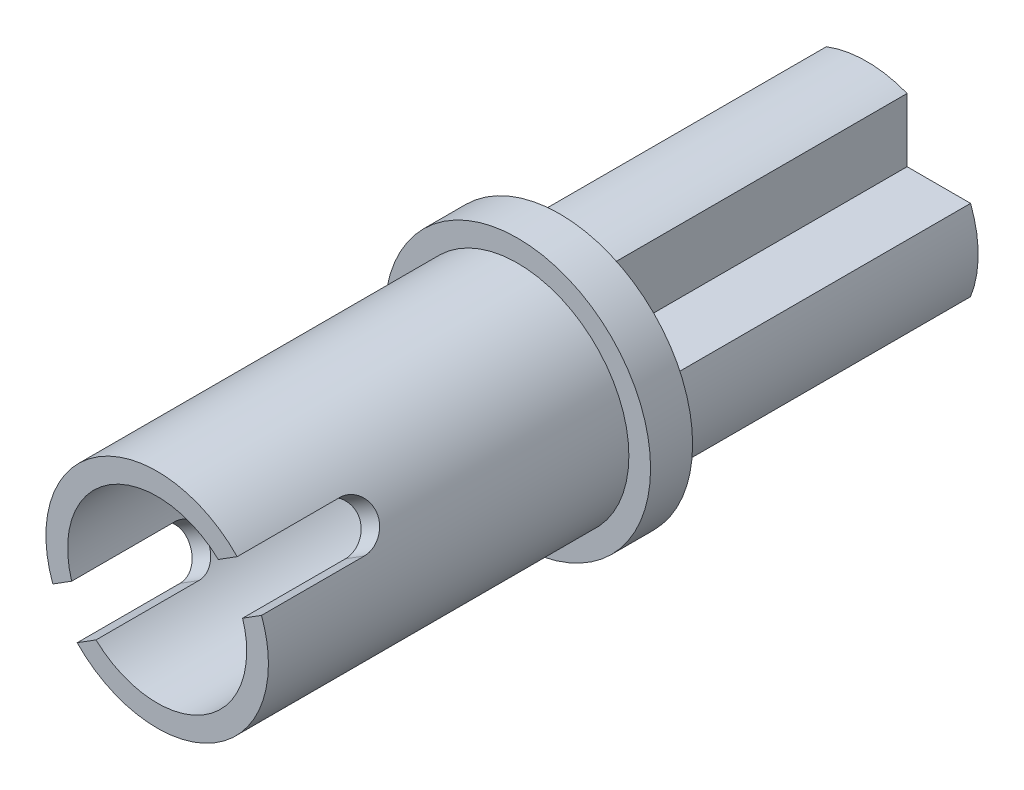
ISO-10303-21;
HEADER;
FILE_DESCRIPTION(('STEP AP214'),'2;1');
FILE_NAME('part.step','',(''),(''),'','','');
FILE_SCHEMA(('AUTOMOTIVE_DESIGN { 1 0 10303 214 1 1 1 1 }'));
ENDSEC;
DATA;
#1=APPLICATION_CONTEXT('core data for automotive mechanical design processes');
#2=APPLICATION_PROTOCOL_DEFINITION('international standard','automotive_design',2000,#1);
#3=PRODUCT_CONTEXT('',#1,'mechanical');
#4=PRODUCT('Part','Part','',(#3));
#5=PRODUCT_RELATED_PRODUCT_CATEGORY('part','',(#4));
#6=PRODUCT_DEFINITION_FORMATION('','',#4);
#7=PRODUCT_DEFINITION_CONTEXT('part definition',#1,'design');
#8=PRODUCT_DEFINITION('design','',#6,#7);
#9=PRODUCT_DEFINITION_SHAPE('','',#8);
#10=(LENGTH_UNIT() NAMED_UNIT(*) SI_UNIT(.MILLI.,.METRE.));
#11=(NAMED_UNIT(*) PLANE_ANGLE_UNIT() SI_UNIT($,.RADIAN.));
#12=(NAMED_UNIT(*) SI_UNIT($,.STERADIAN.) SOLID_ANGLE_UNIT());
#13=UNCERTAINTY_MEASURE_WITH_UNIT(LENGTH_MEASURE(1.E-05),#10,'distance_accuracy_value','');
#14=(GEOMETRIC_REPRESENTATION_CONTEXT(3) GLOBAL_UNCERTAINTY_ASSIGNED_CONTEXT((#13)) GLOBAL_UNIT_ASSIGNED_CONTEXT((#10,
#11,#12)) REPRESENTATION_CONTEXT('',''));
#15=CARTESIAN_POINT('',(0.,0.,0.));
#16=DIRECTION('',(0.,0.,1.));
#17=DIRECTION('',(1.,0.,0.));
#18=AXIS2_PLACEMENT_3D('',#15,#16,#17);
#19=CARTESIAN_POINT('',(0.,0.,15.53));
#20=DIRECTION('',(0.,0.,-1.));
#21=DIRECTION('',(-1.,0.,0.));
#22=AXIS2_PLACEMENT_3D('',#19,#20,#21);
#23=CYLINDRICAL_SURFACE('',#22,2.91);
#24=CARTESIAN_POINT('',(0.,0.,7.64));
#25=DIRECTION('',(0.,0.,1.));
#26=DIRECTION('',(1.,0.,0.));
#27=AXIS2_PLACEMENT_3D('',#24,#25,#26);
#28=CIRCLE('',#27,2.91);
#29=CARTESIAN_POINT('',(2.91,0.,7.64));
#30=VERTEX_POINT('',#29);
#31=EDGE_CURVE('E362',#30,#30,#28,.T.);
#32=ORIENTED_EDGE('',*,*,#31,.F.);
#33=EDGE_LOOP('',(#32));
#34=FACE_BOUND('',#33,.T.);
#35=CARTESIAN_POINT('',(0.,0.,6.72));
#36=DIRECTION('',(0.,0.,-1.));
#37=DIRECTION('',(-1.,0.,0.));
#38=AXIS2_PLACEMENT_3D('',#35,#36,#37);
#39=CIRCLE('',#38,2.91);
#40=CARTESIAN_POINT('',(-2.91,0.,6.72));
#41=VERTEX_POINT('',#40);
#42=EDGE_CURVE('E184',#41,#41,#39,.T.);
#43=ORIENTED_EDGE('',*,*,#42,.F.);
#44=EDGE_LOOP('',(#43));
#45=FACE_BOUND('',#44,.T.);
#46=ADVANCED_FACE('F33',(#34,#45),#23,.T.);
#47=CARTESIAN_POINT('',(0.,0.,15.53));
#48=DIRECTION('',(0.,0.,1.));
#49=DIRECTION('',(1.,0.,0.));
#50=AXIS2_PLACEMENT_3D('',#47,#48,#49);
#51=PLANE('',#50);
#52=DIRECTION('',(-0.846684812986622,-0.532094754210008,0.));
#53=VECTOR('',#52,1.);
#54=CARTESIAN_POINT('',(4.88471303194703,2.47923447772228,15.53));
#55=LINE('',#54,#53);
#56=CARTESIAN_POINT('',(-1.33854879318288,-1.43174268926671,15.53));
#57=VERTEX_POINT('',#56);
#58=CARTESIAN_POINT('',(-1.75169775094782,-1.69138404548593,15.53));
#59=VERTEX_POINT('',#58);
#60=EDGE_CURVE('E272',#57,#59,#55,.T.);
#61=ORIENTED_EDGE('',*,*,#60,.T.);
#62=CARTESIAN_POINT('',(0.,0.,15.53));
#63=DIRECTION('',(0.,0.,1.));
#64=DIRECTION('',(1.,0.,0.));
#65=AXIS2_PLACEMENT_3D('',#62,#63,#64);
#66=CIRCLE('',#65,2.435);
#67=CARTESIAN_POINT('',(2.28379250515783,0.8446992324993,15.53));
#68=VERTEX_POINT('',#67);
#69=EDGE_CURVE('E601',#59,#68,#66,.T.);
#70=ORIENTED_EDGE('',*,*,#69,.T.);
#71=CARTESIAN_POINT('',(1.87064354739289,0.585057876280083,15.53));
#72=VERTEX_POINT('',#71);
#73=EDGE_CURVE('E275',#68,#72,#55,.T.);
#74=ORIENTED_EDGE('',*,*,#73,.T.);
#75=CARTESIAN_POINT('',(0.,0.,15.53));
#76=DIRECTION('',(0.,0.,1.));
#77=DIRECTION('',(1.,0.,0.));
#78=AXIS2_PLACEMENT_3D('',#75,#76,#77);
#79=CIRCLE('',#78,1.96);
#80=EDGE_CURVE('E605',#57,#72,#79,.T.);
#81=ORIENTED_EDGE('',*,*,#80,.F.);
#82=EDGE_LOOP('',(#61,#70,#74,#81));
#83=FACE_BOUND('',#82,.T.);
#84=ADVANCED_FACE('F351',(#83),#51,.T.);
#85=CARTESIAN_POINT('',(0.,0.,7.64));
#86=DIRECTION('',(0.,0.,1.));
#87=DIRECTION('',(1.,0.,0.));
#88=AXIS2_PLACEMENT_3D('',#85,#86,#87);
#89=PLANE('',#88);
#90=CARTESIAN_POINT('',(0.,0.,7.64));
#91=DIRECTION('',(0.,0.,1.));
#92=DIRECTION('',(1.,0.,0.));
#93=AXIS2_PLACEMENT_3D('',#90,#91,#92);
#94=CIRCLE('',#93,2.435);
#95=CARTESIAN_POINT('',(2.435,0.,7.64));
#96=VERTEX_POINT('',#95);
#97=EDGE_CURVE('E594',#96,#96,#94,.T.);
#98=ORIENTED_EDGE('',*,*,#97,.F.);
#99=EDGE_LOOP('',(#98));
#100=FACE_BOUND('',#99,.T.);
#101=ORIENTED_EDGE('',*,*,#31,.T.);
#102=EDGE_LOOP('',(#101));
#103=FACE_BOUND('',#102,.T.);
#104=ADVANCED_FACE('F356',(#100,#103),#89,.T.);
#105=CARTESIAN_POINT('',(0.,0.,7.64));
#106=DIRECTION('',(0.,0.,1.));
#107=DIRECTION('',(1.,0.,0.));
#108=AXIS2_PLACEMENT_3D('',#105,#106,#107);
#109=CYLINDRICAL_SURFACE('',#108,2.435);
#110=CARTESIAN_POINT('',(-2.28379250515783,-0.844699232499302,13.28));
#111=CARTESIAN_POINT('',(-2.28378971702096,-0.844667637052202,13.2521856948618));
#112=CARTESIAN_POINT('',(-2.28297031556745,-0.846921727216476,13.2243853297915));
#113=CARTESIAN_POINT('',(-2.27967977785258,-0.855759707768166,13.1696259735518));
#114=CARTESIAN_POINT('',(-2.27721130367683,-0.862336619581587,13.1426656995279));
#115=CARTESIAN_POINT('',(-2.27060393480973,-0.879580874327465,13.0903031060443));
#116=CARTESIAN_POINT('',(-2.26646488824169,-0.890248589162547,13.0649009284777));
#117=CARTESIAN_POINT('',(-2.25648302071709,-0.915254727640639,13.0163368674321));
#118=CARTESIAN_POINT('',(-2.25063999598677,-0.929593590280451,12.993175252337));
#119=CARTESIAN_POINT('',(-2.23713484689572,-0.961643301271441,12.9494125619053));
#120=CARTESIAN_POINT('',(-2.22944965324161,-0.979396296754901,12.9288494648487));
#121=CARTESIAN_POINT('',(-2.21230130941203,-1.0175384506943,12.8911970706882));
#122=CARTESIAN_POINT('',(-2.20283788354486,-1.03792801776317,12.8741083130917));
#123=CARTESIAN_POINT('',(-2.18209102937489,-1.08086844703852,12.8437426388008));
#124=CARTESIAN_POINT('',(-2.17079166638916,-1.10343745831996,12.8305022164894));
#125=CARTESIAN_POINT('',(-2.14657664332263,-1.14983369243828,12.8084453404684));
#126=CARTESIAN_POINT('',(-2.13366123021908,-1.17366072269404,12.7996282117861));
#127=CARTESIAN_POINT('',(-2.10664998108618,-1.22147204739127,12.7867866940831));
#128=CARTESIAN_POINT('',(-2.09257297431951,-1.24544959160199,12.782697608253));
#129=CARTESIAN_POINT('',(-2.06343788928413,-1.2931472061719,12.7792262562499));
#130=CARTESIAN_POINT('',(-2.04837988787517,-1.31686729653283,12.7798436217708));
#131=CARTESIAN_POINT('',(-2.01796493094521,-1.36300956150701,12.7857189986761));
#132=CARTESIAN_POINT('',(-2.00261585896622,-1.38544587656017,12.7909071920974));
#133=CARTESIAN_POINT('',(-1.97190586409637,-1.42881727265183,12.8056660264276));
#134=CARTESIAN_POINT('',(-1.95654494081983,-1.44975230255483,12.8152368165309));
#135=CARTESIAN_POINT('',(-1.92625476676292,-1.48976576454618,12.838553185845));
#136=CARTESIAN_POINT('',(-1.91132903972738,-1.50883101238652,12.852325937388));
#137=CARTESIAN_POINT('',(-1.88258139572417,-1.54455131026279,12.8836347352985));
#138=CARTESIAN_POINT('',(-1.86875957786258,-1.56120614400681,12.9011711190351));
#139=CARTESIAN_POINT('',(-1.84253752145919,-1.59207373597353,12.939889024035));
#140=CARTESIAN_POINT('',(-1.83016783042066,-1.60623637897754,12.9611312285827));
#141=CARTESIAN_POINT('',(-1.80769637381617,-1.63148566469815,13.0064655518973));
#142=CARTESIAN_POINT('',(-1.79759523439554,-1.64257145836893,13.0305584546936));
#143=CARTESIAN_POINT('',(-1.78012448197748,-1.66148992671888,13.0810010680532));
#144=CARTESIAN_POINT('',(-1.77276289386813,-1.66931305211222,13.1073571347819));
#145=CARTESIAN_POINT('',(-1.76120464771841,-1.68150377768271,13.1615017749676));
#146=CARTESIAN_POINT('',(-1.75700327632771,-1.68587652445579,13.1892881487702));
#147=CARTESIAN_POINT('',(-1.75356089201524,-1.6894526447767,13.2277488228165));
#148=CARTESIAN_POINT('',(-1.75286223945769,-1.69017732121894,13.2381827668803));
#149=CARTESIAN_POINT('',(-1.75193119670278,-1.69114238743115,13.2590762307359));
#150=CARTESIAN_POINT('',(-1.75169802760538,-1.69138358621387,13.2695356784315));
#151=CARTESIAN_POINT('',(-1.75169775094785,-1.69138404548595,13.28));
#152=B_SPLINE_CURVE_WITH_KNOTS('',3,(#110,#111,#112,#113,#114,#115,#116,#117,#118,#119,#120,
#121,#122,#123,#124,#125,#126,#127,#128,#129,#130,#131,#132,#133,#134,#135,#136,#137,#138,#139,
#140,#141,#142,#143,#144,#145,#146,#147,#148,#149,#150,#151),.UNSPECIFIED.,.F.,.F.,(4,2,2,2,2,2,
2,2,2,2,2,2,2,2,2,2,2,2,2,2,4),(0.,0.0833185227820157,0.166502869069426,0.24969477959631,
0.332896642883479,0.417200532884424,0.501517503902673,0.586609763040074,0.67168903356927,
0.755589793680535,0.839483988155208,0.922118520658541,1.00475586645304,1.08793934597888,
1.17113028512508,1.25583946545347,1.34057199779639,1.42555081662391,1.51040263988825,
1.54183315161573,1.57321102599315),.UNSPECIFIED.);
#153=CARTESIAN_POINT('',(-2.28379250515783,-0.844699232499301,13.28));
#154=VERTEX_POINT('',#153);
#155=CARTESIAN_POINT('',(-1.75169775094782,-1.69138404548593,13.28));
#156=VERTEX_POINT('',#155);
#157=EDGE_CURVE('E288',#154,#156,#152,.T.);
#158=ORIENTED_EDGE('',*,*,#157,.F.);
#159=DIRECTION('',(0.,0.,1.));
#160=VECTOR('',#159,1.);
#161=CARTESIAN_POINT('',(-2.28379250515783,-0.844699232499304,7.64));
#162=LINE('',#161,#160);
#163=CARTESIAN_POINT('',(-2.28379250515783,-0.844699232499301,15.53));
#164=VERTEX_POINT('',#163);
#165=EDGE_CURVE('E286',#164,#154,#162,.F.);
#166=ORIENTED_EDGE('',*,*,#165,.F.);
#167=CARTESIAN_POINT('',(1.75169775094782,1.69138404548593,15.53));
#168=VERTEX_POINT('',#167);
#169=EDGE_CURVE('E598',#168,#164,#66,.T.);
#170=ORIENTED_EDGE('',*,*,#169,.F.);
#171=DIRECTION('',(0.,0.,1.));
#172=VECTOR('',#171,1.);
#173=CARTESIAN_POINT('',(1.75169775094783,1.69138404548592,7.64));
#174=LINE('',#173,#172);
#175=CARTESIAN_POINT('',(1.75169775094783,1.69138404548593,13.28));
#176=VERTEX_POINT('',#175);
#177=EDGE_CURVE('E284',#176,#168,#174,.T.);
#178=ORIENTED_EDGE('',*,*,#177,.F.);
#179=CARTESIAN_POINT('',(2.28379250515783,0.844699232499301,13.28));
#180=CARTESIAN_POINT('',(2.28378971702096,0.844667637052201,13.2521856948618));
#181=CARTESIAN_POINT('',(2.28297031556745,0.846921727216476,13.2243853297915));
#182=CARTESIAN_POINT('',(2.27967977785258,0.855759707768167,13.1696259735518));
#183=CARTESIAN_POINT('',(2.27721130367683,0.862336619581587,13.1426656995279));
#184=CARTESIAN_POINT('',(2.27060393480973,0.879580874327465,13.0903031060443));
#185=CARTESIAN_POINT('',(2.26646488824169,0.890248589162548,13.0649009284777));
#186=CARTESIAN_POINT('',(2.25648302071709,0.91525472764064,13.0163368674321));
#187=CARTESIAN_POINT('',(2.25063999598677,0.929593590280453,12.993175252337));
#188=CARTESIAN_POINT('',(2.23713484689572,0.961643301271442,12.9494125619053));
#189=CARTESIAN_POINT('',(2.22944965324161,0.979396296754902,12.9288494648487));
#190=CARTESIAN_POINT('',(2.21230130941203,1.0175384506943,12.8911970706882));
#191=CARTESIAN_POINT('',(2.20283788354486,1.03792801776317,12.8741083130917));
#192=CARTESIAN_POINT('',(2.18209102937489,1.08086844703852,12.8437426388008));
#193=CARTESIAN_POINT('',(2.17079166638916,1.10343745831996,12.8305022164894));
#194=CARTESIAN_POINT('',(2.14657664332263,1.14983369243828,12.8084453404684));
#195=CARTESIAN_POINT('',(2.13366123021908,1.17366072269404,12.7996282117861));
#196=CARTESIAN_POINT('',(2.10664998108618,1.22147204739127,12.7867866940831));
#197=CARTESIAN_POINT('',(2.09257297431951,1.24544959160199,12.782697608253));
#198=CARTESIAN_POINT('',(2.06343788928413,1.2931472061719,12.7792262562499));
#199=CARTESIAN_POINT('',(2.04837988787517,1.31686729653283,12.7798436217708));
#200=CARTESIAN_POINT('',(2.01796493094521,1.36300956150701,12.7857189986761));
#201=CARTESIAN_POINT('',(2.00261585896622,1.38544587656017,12.7909071920974));
#202=CARTESIAN_POINT('',(1.97190586409637,1.42881727265183,12.8056660264276));
#203=CARTESIAN_POINT('',(1.95654494081983,1.44975230255483,12.8152368165309));
#204=CARTESIAN_POINT('',(1.92625476676292,1.48976576454618,12.838553185845));
#205=CARTESIAN_POINT('',(1.91132903972738,1.50883101238652,12.852325937388));
#206=CARTESIAN_POINT('',(1.88258139572417,1.54455131026279,12.8836347352985));
#207=CARTESIAN_POINT('',(1.86875957786259,1.5612061440068,12.9011711190351));
#208=CARTESIAN_POINT('',(1.84253752145919,1.59207373597353,12.939889024035));
#209=CARTESIAN_POINT('',(1.83016783042066,1.60623637897754,12.9611312285827));
#210=CARTESIAN_POINT('',(1.80769637381617,1.63148566469815,13.0064655518973));
#211=CARTESIAN_POINT('',(1.79759523439554,1.64257145836893,13.0305584546936));
#212=CARTESIAN_POINT('',(1.78012448197748,1.66148992671888,13.0810010680532));
#213=CARTESIAN_POINT('',(1.77276289386813,1.66931305211222,13.1073571347819));
#214=CARTESIAN_POINT('',(1.76120464771841,1.68150377768271,13.1615017749676));
#215=CARTESIAN_POINT('',(1.75700327632771,1.68587652445579,13.1892881487702));
#216=CARTESIAN_POINT('',(1.75356089201524,1.6894526447767,13.2277488228165));
#217=CARTESIAN_POINT('',(1.75286223945769,1.69017732121894,13.2381827668803));
#218=CARTESIAN_POINT('',(1.75193119670278,1.69114238743115,13.2590762307359));
#219=CARTESIAN_POINT('',(1.75169802760538,1.69138358621387,13.2695356784315));
#220=CARTESIAN_POINT('',(1.75169775094785,1.69138404548595,13.28));
#221=B_SPLINE_CURVE_WITH_KNOTS('',3,(#179,#180,#181,#182,#183,#184,#185,#186,#187,#188,#189,
#190,#191,#192,#193,#194,#195,#196,#197,#198,#199,#200,#201,#202,#203,#204,#205,#206,#207,#208,
#209,#210,#211,#212,#213,#214,#215,#216,#217,#218,#219,#220),.UNSPECIFIED.,.F.,.F.,(4,2,2,2,2,2,
2,2,2,2,2,2,2,2,2,2,2,2,2,2,4),(0.,0.0833185227820157,0.166502869069426,0.249694779596314,
0.332896642883482,0.417200532884425,0.501517503902674,0.586609763040074,0.67168903356927,
0.755589793680535,0.839483988155207,0.92211852065854,1.00475586645304,1.08793934597888,
1.17113028512508,1.25583946545346,1.34057199779639,1.42555081662391,1.51040263988825,
1.54183315161573,1.57321102599315),.UNSPECIFIED.);
#222=CARTESIAN_POINT('',(2.28379250515783,0.8446992324993,13.28));
#223=VERTEX_POINT('',#222);
#224=EDGE_CURVE('E296',#223,#176,#221,.T.);
#225=ORIENTED_EDGE('',*,*,#224,.F.);
#226=DIRECTION('',(0.,0.,1.));
#227=VECTOR('',#226,1.);
#228=CARTESIAN_POINT('',(2.28379250515783,0.844699232499302,7.64));
#229=LINE('',#228,#227);
#230=EDGE_CURVE('E609',#68,#223,#229,.F.);
#231=ORIENTED_EDGE('',*,*,#230,.F.);
#232=ORIENTED_EDGE('',*,*,#69,.F.);
#233=DIRECTION('',(0.,0.,1.));
#234=VECTOR('',#233,1.);
#235=CARTESIAN_POINT('',(-1.75169775094783,-1.69138404548593,7.64));
#236=LINE('',#235,#234);
#237=EDGE_CURVE('E611',#156,#59,#236,.T.);
#238=ORIENTED_EDGE('',*,*,#237,.F.);
#239=EDGE_LOOP('',(#158,#166,#170,#178,#225,#231,#232,#238));
#240=FACE_BOUND('',#239,.T.);
#241=ORIENTED_EDGE('',*,*,#97,.T.);
#242=EDGE_LOOP('',(#241));
#243=FACE_BOUND('',#242,.T.);
#244=ADVANCED_FACE('F302',(#240,#243),#109,.T.);
#245=DIRECTION('',(-0.846684812986622,-0.532094754210008,0.));
#246=VECTOR('',#245,1.);
#247=CARTESIAN_POINT('',(4.35261827773702,3.3259192907089,15.53));
#248=LINE('',#247,#246);
#249=CARTESIAN_POINT('',(1.33854879318288,1.43174268926671,15.53));
#250=VERTEX_POINT('',#249);
#251=EDGE_CURVE('E282',#168,#250,#248,.T.);
#252=ORIENTED_EDGE('',*,*,#251,.F.);
#253=ORIENTED_EDGE('',*,*,#169,.T.);
#254=CARTESIAN_POINT('',(-1.87064354739289,-0.585057876280084,15.53));
#255=VERTEX_POINT('',#254);
#256=EDGE_CURVE('E252',#255,#164,#248,.T.);
#257=ORIENTED_EDGE('',*,*,#256,.F.);
#258=EDGE_CURVE('E608',#250,#255,#79,.T.);
#259=ORIENTED_EDGE('',*,*,#258,.F.);
#260=EDGE_LOOP('',(#252,#253,#257,#259));
#261=FACE_BOUND('',#260,.T.);
#262=ADVANCED_FACE('F340',(#261),#51,.T.);
#263=CARTESIAN_POINT('',(0.,0.,7.64));
#264=DIRECTION('',(0.,0.,1.));
#265=DIRECTION('',(1.,0.,0.));
#266=AXIS2_PLACEMENT_3D('',#263,#264,#265);
#267=CYLINDRICAL_SURFACE('',#266,1.96);
#268=CARTESIAN_POINT('',(0.,0.,7.64));
#269=DIRECTION('',(0.,0.,1.));
#270=DIRECTION('',(1.,0.,0.));
#271=AXIS2_PLACEMENT_3D('',#268,#269,#270);
#272=CIRCLE('',#271,1.96);
#273=CARTESIAN_POINT('',(1.96,0.,7.64));
#274=VERTEX_POINT('',#273);
#275=EDGE_CURVE('E603',#274,#274,#272,.T.);
#276=ORIENTED_EDGE('',*,*,#275,.F.);
#277=EDGE_LOOP('',(#276));
#278=FACE_BOUND('',#277,.T.);
#279=CARTESIAN_POINT('',(-1.87064354739289,-0.585057876280084,13.28));
#280=CARTESIAN_POINT('',(-1.8706369817185,-0.58502305857861,13.2523580284803));
#281=CARTESIAN_POINT('',(-1.86993634209892,-0.587318620230676,13.2247338102415));
#282=CARTESIAN_POINT('',(-1.86710086484578,-0.596299917377582,13.1703407486798));
#283=CARTESIAN_POINT('',(-1.86496901956035,-0.602976492443909,13.1435702425043));
#284=CARTESIAN_POINT('',(-1.85922579302987,-0.620450252062099,13.0915859538829));
#285=CARTESIAN_POINT('',(-1.85561458586746,-0.631246951771609,13.0663719886739));
#286=CARTESIAN_POINT('',(-1.84682821694164,-0.656509743623638,13.0181476879052));
#287=CARTESIAN_POINT('',(-1.84165260656196,-0.670976888130254,12.9951379869474));
#288=CARTESIAN_POINT('',(-1.82952606560301,-0.703376499106308,12.9514596608153));
#289=CARTESIAN_POINT('',(-1.82254089476927,-0.721373963886385,12.9308487421589));
#290=CARTESIAN_POINT('',(-1.80677437103984,-0.760000634677702,12.8930599360145));
#291=CARTESIAN_POINT('',(-1.79799273020897,-0.780630262367883,12.8758825997288));
#292=CARTESIAN_POINT('',(-1.77847039054172,-0.824147490915315,12.8452112946053));
#293=CARTESIAN_POINT('',(-1.76770302839199,-0.847063595564044,12.8317745997366));
#294=CARTESIAN_POINT('',(-1.74437289113013,-0.8941206957199,12.8093392813317));
#295=CARTESIAN_POINT('',(-1.7318104802032,-0.918261442128599,12.8003397592121));
#296=CARTESIAN_POINT('',(-1.70537747465884,-0.966450555722063,12.7872199086017));
#297=CARTESIAN_POINT('',(-1.6915399684605,-0.990490178349862,12.7830008982384));
#298=CARTESIAN_POINT('',(-1.66267398885227,-1.03821599276028,12.7792518341273));
#299=CARTESIAN_POINT('',(-1.64764567251141,-1.06190223066658,12.7797211630009));
#300=CARTESIAN_POINT('',(-1.61721314986559,-1.10768235008808,12.785265105978));
#301=CARTESIAN_POINT('',(-1.6018256496031,-1.12980037755542,12.7902330714525));
#302=CARTESIAN_POINT('',(-1.57086446180509,-1.17246751673652,12.8044615263123));
#303=CARTESIAN_POINT('',(-1.55529076587438,-1.19301655739692,12.8137222099642));
#304=CARTESIAN_POINT('',(-1.52437629280952,-1.23227741924323,12.836358254399));
#305=CARTESIAN_POINT('',(-1.50903904415918,-1.25097031176449,12.8497711965652));
#306=CARTESIAN_POINT('',(-1.47934188136121,-1.28595291224098,12.8803021702647));
#307=CARTESIAN_POINT('',(-1.46498212211269,-1.30224223978753,12.8974207872343));
#308=CARTESIAN_POINT('',(-1.43744961324571,-1.33258040645453,12.9354448712973));
#309=CARTESIAN_POINT('',(-1.42432146304254,-1.3465535746833,12.9564430983686));
#310=CARTESIAN_POINT('',(-1.40033551817237,-1.37148118211431,13.0013414228821));
#311=CARTESIAN_POINT('',(-1.38947834656656,-1.3824347931382,13.0252423138581));
#312=CARTESIAN_POINT('',(-1.37054349909123,-1.40121019599323,13.075449105509));
#313=CARTESIAN_POINT('',(-1.36248218655339,-1.40901359273481,13.1017680610952));
#314=CARTESIAN_POINT('',(-1.34970090810799,-1.4212625169128,13.1559337118273));
#315=CARTESIAN_POINT('',(-1.34497594121288,-1.42571307073816,13.1837780527046));
#316=CARTESIAN_POINT('',(-1.3408911868108,-1.42954978228293,13.2232212102507));
#317=CARTESIAN_POINT('',(-1.34001311222548,-1.43037253009267,13.2345528884762));
#318=CARTESIAN_POINT('',(-1.33884244083138,-1.43146829884039,13.2572545708216));
#319=CARTESIAN_POINT('',(-1.33854890260294,-1.43174220371677,13.2686244837258));
#320=CARTESIAN_POINT('',(-1.33854879318288,-1.43174268926671,13.28));
#321=B_SPLINE_CURVE_WITH_KNOTS('',3,(#279,#280,#281,#282,#283,#284,#285,#286,#287,#288,#289,
#290,#291,#292,#293,#294,#295,#296,#297,#298,#299,#300,#301,#302,#303,#304,#305,#306,#307,#308,
#309,#310,#311,#312,#313,#314,#315,#316,#317,#318,#319,#320),.UNSPECIFIED.,.F.,.F.,(4,2,2,2,2,2,
2,2,2,2,2,2,2,2,2,2,2,2,2,2,4),(0.,0.0827946054034033,0.165416641699347,0.248028958309789,
0.330664987762364,0.414996178778325,0.499340896860617,0.58491372753952,0.670469221515929,
0.754224484156002,0.837968717725719,0.919778168074572,1.00159132106307,1.08416774050035,
1.16675721519911,1.25166355265317,1.3365931543754,1.422011752394,1.50730203954254,
1.5414654420302,1.57557377831848),.UNSPECIFIED.);
#322=CARTESIAN_POINT('',(-1.87064354739288,-0.585057876280086,13.28));
#323=VERTEX_POINT('',#322);
#324=CARTESIAN_POINT('',(-1.33854879318288,-1.43174268926671,13.28));
#325=VERTEX_POINT('',#324);
#326=EDGE_CURVE('E40',#323,#325,#321,.T.);
#327=ORIENTED_EDGE('',*,*,#326,.T.);
#328=DIRECTION('',(0.,0.,1.));
#329=VECTOR('',#328,1.);
#330=CARTESIAN_POINT('',(-1.33854879318288,-1.43174268926671,7.64));
#331=LINE('',#330,#329);
#332=EDGE_CURVE('E11',#325,#57,#331,.T.);
#333=ORIENTED_EDGE('',*,*,#332,.T.);
#334=ORIENTED_EDGE('',*,*,#80,.T.);
#335=DIRECTION('',(0.,0.,1.));
#336=VECTOR('',#335,1.);
#337=CARTESIAN_POINT('',(1.87064354739289,0.585057876280084,7.64));
#338=LINE('',#337,#336);
#339=CARTESIAN_POINT('',(1.87064354739289,0.585057876280083,13.28));
#340=VERTEX_POINT('',#339);
#341=EDGE_CURVE('E633',#72,#340,#338,.F.);
#342=ORIENTED_EDGE('',*,*,#341,.T.);
#343=CARTESIAN_POINT('',(1.87064354739288,0.585057876280083,13.28));
#344=CARTESIAN_POINT('',(1.8706369817185,0.58502305857861,13.2523580284803));
#345=CARTESIAN_POINT('',(1.86993634209892,0.587318620230676,13.2247338102415));
#346=CARTESIAN_POINT('',(1.86710086484578,0.596299917377582,13.1703407486798));
#347=CARTESIAN_POINT('',(1.86496901956035,0.602976492443909,13.1435702425043));
#348=CARTESIAN_POINT('',(1.85922579302987,0.620450252062099,13.0915859538829));
#349=CARTESIAN_POINT('',(1.85561458586746,0.63124695177161,13.0663719886739));
#350=CARTESIAN_POINT('',(1.84682821694164,0.656509743623639,13.0181476879052));
#351=CARTESIAN_POINT('',(1.84165260656196,0.670976888130254,12.9951379869474));
#352=CARTESIAN_POINT('',(1.82952606560301,0.703376499106308,12.9514596608153));
#353=CARTESIAN_POINT('',(1.82254089476927,0.721373963886385,12.9308487421589));
#354=CARTESIAN_POINT('',(1.80677437103984,0.760000634677702,12.8930599360145));
#355=CARTESIAN_POINT('',(1.79799273020897,0.780630262367884,12.8758825997288));
#356=CARTESIAN_POINT('',(1.77847039054172,0.824147490915315,12.8452112946053));
#357=CARTESIAN_POINT('',(1.76770302839199,0.847063595564044,12.8317745997366));
#358=CARTESIAN_POINT('',(1.74437289113013,0.894120695719899,12.8093392813317));
#359=CARTESIAN_POINT('',(1.7318104802032,0.918261442128599,12.8003397592121));
#360=CARTESIAN_POINT('',(1.70537747465884,0.966450555722063,12.7872199086017));
#361=CARTESIAN_POINT('',(1.6915399684605,0.990490178349862,12.7830008982384));
#362=CARTESIAN_POINT('',(1.66267398885227,1.03821599276028,12.7792518341273));
#363=CARTESIAN_POINT('',(1.64764567251141,1.06190223066658,12.7797211630009));
#364=CARTESIAN_POINT('',(1.61721314986559,1.10768235008808,12.785265105978));
#365=CARTESIAN_POINT('',(1.6018256496031,1.12980037755542,12.7902330714525));
#366=CARTESIAN_POINT('',(1.57086446180509,1.17246751673652,12.8044615263123));
#367=CARTESIAN_POINT('',(1.55529076587438,1.19301655739692,12.8137222099642));
#368=CARTESIAN_POINT('',(1.52437629280952,1.23227741924323,12.836358254399));
#369=CARTESIAN_POINT('',(1.50903904415918,1.25097031176449,12.8497711965652));
#370=CARTESIAN_POINT('',(1.47934188136121,1.28595291224098,12.8803021702647));
#371=CARTESIAN_POINT('',(1.46498212211269,1.30224223978754,12.8974207872343));
#372=CARTESIAN_POINT('',(1.43744961324571,1.33258040645453,12.9354448712973));
#373=CARTESIAN_POINT('',(1.42432146304254,1.3465535746833,12.9564430983686));
#374=CARTESIAN_POINT('',(1.40033551817237,1.37148118211431,13.0013414228821));
#375=CARTESIAN_POINT('',(1.38947834656656,1.3824347931382,13.0252423138581));
#376=CARTESIAN_POINT('',(1.37054349909123,1.40121019599323,13.075449105509));
#377=CARTESIAN_POINT('',(1.36248218655339,1.40901359273481,13.1017680610952));
#378=CARTESIAN_POINT('',(1.34970090810799,1.4212625169128,13.1559337118273));
#379=CARTESIAN_POINT('',(1.34497594121288,1.42571307073816,13.1837780527046));
#380=CARTESIAN_POINT('',(1.3408911868108,1.42954978228293,13.2232212102507));
#381=CARTESIAN_POINT('',(1.34001311222548,1.43037253009267,13.2345528884762));
#382=CARTESIAN_POINT('',(1.33884244083138,1.43146829884039,13.2572545708216));
#383=CARTESIAN_POINT('',(1.33854890260294,1.43174220371677,13.2686244837258));
#384=CARTESIAN_POINT('',(1.33854879318288,1.43174268926671,13.28));
#385=B_SPLINE_CURVE_WITH_KNOTS('',3,(#343,#344,#345,#346,#347,#348,#349,#350,#351,#352,#353,
#354,#355,#356,#357,#358,#359,#360,#361,#362,#363,#364,#365,#366,#367,#368,#369,#370,#371,#372,
#373,#374,#375,#376,#377,#378,#379,#380,#381,#382,#383,#384),.UNSPECIFIED.,.F.,.F.,(4,2,2,2,2,2,
2,2,2,2,2,2,2,2,2,2,2,2,2,2,4),(0.,0.0827946054034033,0.165416641699347,0.248028958309789,
0.330664987762364,0.414996178778325,0.499340896860617,0.584913727539519,0.670469221515929,
0.754224484156002,0.837968717725719,0.919778168074571,1.00159132106307,1.08416774050035,
1.16675721519911,1.25166355265317,1.3365931543754,1.422011752394,1.50730203954254,
1.5414654420302,1.57557377831848),.UNSPECIFIED.);
#386=CARTESIAN_POINT('',(1.33854879318288,1.43174268926671,13.28));
#387=VERTEX_POINT('',#386);
#388=EDGE_CURVE('E321',#340,#387,#385,.T.);
#389=ORIENTED_EDGE('',*,*,#388,.T.);
#390=DIRECTION('',(0.,0.,1.));
#391=VECTOR('',#390,1.);
#392=CARTESIAN_POINT('',(1.33854879318288,1.43174268926671,7.64));
#393=LINE('',#392,#391);
#394=EDGE_CURVE('E595',#387,#250,#393,.T.);
#395=ORIENTED_EDGE('',*,*,#394,.T.);
#396=ORIENTED_EDGE('',*,*,#258,.T.);
#397=DIRECTION('',(0.,0.,1.));
#398=VECTOR('',#397,1.);
#399=CARTESIAN_POINT('',(-1.87064354739288,-0.585057876280086,7.64));
#400=LINE('',#399,#398);
#401=EDGE_CURVE('E335',#255,#323,#400,.F.);
#402=ORIENTED_EDGE('',*,*,#401,.T.);
#403=EDGE_LOOP('',(#327,#333,#334,#342,#389,#395,#396,#402));
#404=FACE_BOUND('',#403,.T.);
#405=ADVANCED_FACE('F336',(#278,#404),#267,.F.);
#406=CARTESIAN_POINT('',(0.,0.,7.64));
#407=DIRECTION('',(0.,0.,1.));
#408=DIRECTION('',(1.,0.,0.));
#409=AXIS2_PLACEMENT_3D('',#406,#407,#408);
#410=PLANE('',#409);
#411=ORIENTED_EDGE('',*,*,#275,.T.);
#412=EDGE_LOOP('',(#411));
#413=FACE_BOUND('',#412,.T.);
#414=ADVANCED_FACE('F339',(#413),#410,.T.);
#415=CARTESIAN_POINT('',(4.35261827773702,3.3259192907089,15.53));
#416=DIRECTION('',(-0.532094754210008,0.846684812986622,0.));
#417=DIRECTION('',(-0.846684812986622,-0.532094754210008,0.));
#418=AXIS2_PLACEMENT_3D('',#415,#416,#417);
#419=PLANE('',#418);
#420=ORIENTED_EDGE('',*,*,#177,.T.);
#421=ORIENTED_EDGE('',*,*,#251,.T.);
#422=ORIENTED_EDGE('',*,*,#394,.F.);
#423=DIRECTION('',(-0.846684812986622,-0.532094754210008,0.));
#424=VECTOR('',#423,1.);
#425=CARTESIAN_POINT('',(4.35261827773702,3.3259192907089,13.28));
#426=LINE('',#425,#424);
#427=EDGE_CURVE('E280',#176,#387,#426,.T.);
#428=ORIENTED_EDGE('',*,*,#427,.F.);
#429=EDGE_LOOP('',(#420,#421,#422,#428));
#430=FACE_BOUND('',#429,.T.);
#431=ADVANCED_FACE('F312',(#430),#419,.F.);
#432=CARTESIAN_POINT('',(4.61866565484202,2.90257688421559,13.28));
#433=DIRECTION('',(-0.846684812986622,-0.532094754210008,0.));
#434=DIRECTION('',(0.532094754210008,-0.846684812986622,0.));
#435=AXIS2_PLACEMENT_3D('',#432,#433,#434);
#436=CYLINDRICAL_SURFACE('',#435,0.500000000000001);
#437=ORIENTED_EDGE('',*,*,#224,.T.);
#438=ORIENTED_EDGE('',*,*,#427,.T.);
#439=ORIENTED_EDGE('',*,*,#388,.F.);
#440=DIRECTION('',(-0.846684812986622,-0.532094754210008,0.));
#441=VECTOR('',#440,1.);
#442=CARTESIAN_POINT('',(4.88471303194703,2.47923447772228,13.28));
#443=LINE('',#442,#441);
#444=EDGE_CURVE('E276',#223,#340,#443,.T.);
#445=ORIENTED_EDGE('',*,*,#444,.F.);
#446=EDGE_LOOP('',(#437,#438,#439,#445));
#447=FACE_BOUND('',#446,.T.);
#448=ADVANCED_FACE('F306',(#447),#436,.F.);
#449=CARTESIAN_POINT('',(4.88471303194703,2.47923447772228,15.53));
#450=DIRECTION('',(0.532094754210008,-0.846684812986622,0.));
#451=DIRECTION('',(0.846684812986622,0.532094754210008,0.));
#452=AXIS2_PLACEMENT_3D('',#449,#450,#451);
#453=PLANE('',#452);
#454=ORIENTED_EDGE('',*,*,#230,.T.);
#455=ORIENTED_EDGE('',*,*,#444,.T.);
#456=ORIENTED_EDGE('',*,*,#341,.F.);
#457=ORIENTED_EDGE('',*,*,#73,.F.);
#458=EDGE_LOOP('',(#454,#455,#456,#457));
#459=FACE_BOUND('',#458,.T.);
#460=ADVANCED_FACE('F311',(#459),#453,.F.);
#461=ORIENTED_EDGE('',*,*,#237,.T.);
#462=ORIENTED_EDGE('',*,*,#60,.F.);
#463=ORIENTED_EDGE('',*,*,#332,.F.);
#464=EDGE_CURVE('E277',#325,#156,#443,.T.);
#465=ORIENTED_EDGE('',*,*,#464,.T.);
#466=EDGE_LOOP('',(#461,#462,#463,#465));
#467=FACE_BOUND('',#466,.T.);
#468=ADVANCED_FACE('F527',(#467),#453,.F.);
#469=ORIENTED_EDGE('',*,*,#157,.T.);
#470=ORIENTED_EDGE('',*,*,#464,.F.);
#471=ORIENTED_EDGE('',*,*,#326,.F.);
#472=EDGE_CURVE('E55',#323,#154,#426,.T.);
#473=ORIENTED_EDGE('',*,*,#472,.T.);
#474=EDGE_LOOP('',(#469,#470,#471,#473));
#475=FACE_BOUND('',#474,.T.);
#476=ADVANCED_FACE('F314',(#475),#436,.F.);
#477=ORIENTED_EDGE('',*,*,#165,.T.);
#478=ORIENTED_EDGE('',*,*,#472,.F.);
#479=ORIENTED_EDGE('',*,*,#401,.F.);
#480=ORIENTED_EDGE('',*,*,#256,.T.);
#481=EDGE_LOOP('',(#477,#478,#479,#480));
#482=FACE_BOUND('',#481,.T.);
#483=ADVANCED_FACE('F316',(#482),#419,.F.);
#484=CARTESIAN_POINT('',(0.,0.,6.72));
#485=DIRECTION('',(0.,0.,-1.));
#486=DIRECTION('',(-1.,0.,0.));
#487=AXIS2_PLACEMENT_3D('',#484,#485,#486);
#488=CYLINDRICAL_SURFACE('',#487,2.44);
#489=CARTESIAN_POINT('',(0.,0.,0.));
#490=DIRECTION('',(0.,0.,-1.));
#491=DIRECTION('',(-1.,0.,0.));
#492=AXIS2_PLACEMENT_3D('',#489,#490,#491);
#493=CIRCLE('',#492,2.44);
#494=CARTESIAN_POINT('',(-2.27384586109085,-0.885000000000001,0.));
#495=VERTEX_POINT('',#494);
#496=CARTESIAN_POINT('',(-2.27384586109085,0.885000000000001,0.));
#497=VERTEX_POINT('',#496);
#498=EDGE_CURVE('E47',#495,#497,#493,.T.);
#499=ORIENTED_EDGE('',*,*,#498,.F.);
#500=DIRECTION('',(0.,0.,-1.));
#501=VECTOR('',#500,1.);
#502=CARTESIAN_POINT('',(-2.27384586109085,-0.885000000000001,6.72));
#503=LINE('',#502,#501);
#504=CARTESIAN_POINT('',(-2.27384586109085,-0.885000000000001,6.72));
#505=VERTEX_POINT('',#504);
#506=EDGE_CURVE('E173',#505,#495,#503,.T.);
#507=ORIENTED_EDGE('',*,*,#506,.F.);
#508=CARTESIAN_POINT('',(0.,0.,6.72));
#509=DIRECTION('',(0.,0.,-1.));
#510=DIRECTION('',(-1.,0.,0.));
#511=AXIS2_PLACEMENT_3D('',#508,#509,#510);
#512=CIRCLE('',#511,2.44);
#513=CARTESIAN_POINT('',(-2.27384586109085,0.885000000000001,6.72));
#514=VERTEX_POINT('',#513);
#515=EDGE_CURVE('E180',#505,#514,#512,.T.);
#516=ORIENTED_EDGE('',*,*,#515,.T.);
#517=DIRECTION('',(0.,0.,-1.));
#518=VECTOR('',#517,1.);
#519=CARTESIAN_POINT('',(-2.27384586109085,0.885000000000001,6.72));
#520=LINE('',#519,#518);
#521=EDGE_CURVE('E250',#514,#497,#520,.T.);
#522=ORIENTED_EDGE('',*,*,#521,.T.);
#523=EDGE_LOOP('',(#499,#507,#516,#522));
#524=FACE_BOUND('',#523,.T.);
#525=ADVANCED_FACE('F182',(#524),#488,.T.);
#526=CARTESIAN_POINT('',(0.,0.885000000000001,6.72));
#527=DIRECTION('',(0.,-1.,0.));
#528=DIRECTION('',(0.,0.,-1.));
#529=AXIS2_PLACEMENT_3D('',#526,#527,#528);
#530=PLANE('',#529);
#531=DIRECTION('',(-1.,0.,0.));
#532=VECTOR('',#531,1.);
#533=CARTESIAN_POINT('',(0.,0.885000000000001,0.));
#534=LINE('',#533,#532);
#535=CARTESIAN_POINT('',(-0.884999999999999,0.885000000000001,0.));
#536=VERTEX_POINT('',#535);
#537=EDGE_CURVE('E192',#536,#497,#534,.T.);
#538=ORIENTED_EDGE('',*,*,#537,.T.);
#539=ORIENTED_EDGE('',*,*,#521,.F.);
#540=DIRECTION('',(-1.,0.,0.));
#541=VECTOR('',#540,1.);
#542=CARTESIAN_POINT('',(0.,0.885000000000001,6.72));
#543=LINE('',#542,#541);
#544=CARTESIAN_POINT('',(-0.884999999999999,0.885000000000001,6.72));
#545=VERTEX_POINT('',#544);
#546=EDGE_CURVE('E191',#545,#514,#543,.T.);
#547=ORIENTED_EDGE('',*,*,#546,.F.);
#548=DIRECTION('',(0.,0.,-1.));
#549=VECTOR('',#548,1.);
#550=CARTESIAN_POINT('',(-0.884999999999999,0.885000000000001,6.72));
#551=LINE('',#550,#549);
#552=EDGE_CURVE('E253',#545,#536,#551,.T.);
#553=ORIENTED_EDGE('',*,*,#552,.T.);
#554=EDGE_LOOP('',(#538,#539,#547,#553));
#555=FACE_BOUND('',#554,.T.);
#556=ADVANCED_FACE('F374',(#555),#530,.F.);
#557=CARTESIAN_POINT('',(-0.884999999999999,0.,6.72));
#558=DIRECTION('',(-1.,0.,0.));
#559=DIRECTION('',(0.,0.,1.));
#560=AXIS2_PLACEMENT_3D('',#557,#558,#559);
#561=PLANE('',#560);
#562=DIRECTION('',(0.,1.,0.));
#563=VECTOR('',#562,1.);
#564=CARTESIAN_POINT('',(-0.884999999999999,0.,0.));
#565=LINE('',#564,#563);
#566=CARTESIAN_POINT('',(-0.884999999999999,2.27384586109085,0.));
#567=VERTEX_POINT('',#566);
#568=EDGE_CURVE('E197',#536,#567,#565,.T.);
#569=ORIENTED_EDGE('',*,*,#568,.F.);
#570=ORIENTED_EDGE('',*,*,#552,.F.);
#571=DIRECTION('',(0.,1.,0.));
#572=VECTOR('',#571,1.);
#573=CARTESIAN_POINT('',(-0.884999999999999,0.,6.72));
#574=LINE('',#573,#572);
#575=CARTESIAN_POINT('',(-0.884999999999999,2.27384586109085,6.72));
#576=VERTEX_POINT('',#575);
#577=EDGE_CURVE('E199',#545,#576,#574,.T.);
#578=ORIENTED_EDGE('',*,*,#577,.T.);
#579=DIRECTION('',(0.,0.,-1.));
#580=VECTOR('',#579,1.);
#581=CARTESIAN_POINT('',(-0.884999999999999,2.27384586109085,6.72));
#582=LINE('',#581,#580);
#583=EDGE_CURVE('E255',#576,#567,#582,.T.);
#584=ORIENTED_EDGE('',*,*,#583,.T.);
#585=EDGE_LOOP('',(#569,#570,#578,#584));
#586=FACE_BOUND('',#585,.T.);
#587=ADVANCED_FACE('F377',(#586),#561,.T.);
#588=CARTESIAN_POINT('',(0.885000000000001,2.27384586109085,0.));
#589=VERTEX_POINT('',#588);
#590=EDGE_CURVE('E229',#567,#589,#493,.T.);
#591=ORIENTED_EDGE('',*,*,#590,.F.);
#592=ORIENTED_EDGE('',*,*,#583,.F.);
#593=CARTESIAN_POINT('',(0.885000000000001,2.27384586109085,6.72));
#594=VERTEX_POINT('',#593);
#595=EDGE_CURVE('E194',#576,#594,#512,.T.);
#596=ORIENTED_EDGE('',*,*,#595,.T.);
#597=DIRECTION('',(0.,0.,-1.));
#598=VECTOR('',#597,1.);
#599=CARTESIAN_POINT('',(0.885000000000001,2.27384586109085,6.72));
#600=LINE('',#599,#598);
#601=EDGE_CURVE('E257',#594,#589,#600,.T.);
#602=ORIENTED_EDGE('',*,*,#601,.T.);
#603=EDGE_LOOP('',(#591,#592,#596,#602));
#604=FACE_BOUND('',#603,.T.);
#605=ADVANCED_FACE('F381',(#604),#488,.T.);
#606=CARTESIAN_POINT('',(0.885000000000001,0.,6.72));
#607=DIRECTION('',(-1.,0.,0.));
#608=DIRECTION('',(0.,0.,1.));
#609=AXIS2_PLACEMENT_3D('',#606,#607,#608);
#610=PLANE('',#609);
#611=DIRECTION('',(0.,1.,0.));
#612=VECTOR('',#611,1.);
#613=CARTESIAN_POINT('',(0.885000000000001,0.,0.));
#614=LINE('',#613,#612);
#615=CARTESIAN_POINT('',(0.885000000000001,0.885000000000001,0.));
#616=VERTEX_POINT('',#615);
#617=EDGE_CURVE('E245',#616,#589,#614,.T.);
#618=ORIENTED_EDGE('',*,*,#617,.T.);
#619=ORIENTED_EDGE('',*,*,#601,.F.);
#620=DIRECTION('',(0.,1.,0.));
#621=VECTOR('',#620,1.);
#622=CARTESIAN_POINT('',(0.885000000000001,0.,6.72));
#623=LINE('',#622,#621);
#624=CARTESIAN_POINT('',(0.885000000000001,0.885000000000001,6.72));
#625=VERTEX_POINT('',#624);
#626=EDGE_CURVE('E200',#625,#594,#623,.T.);
#627=ORIENTED_EDGE('',*,*,#626,.F.);
#628=DIRECTION('',(0.,0.,-1.));
#629=VECTOR('',#628,1.);
#630=CARTESIAN_POINT('',(0.885000000000001,0.885000000000001,6.72));
#631=LINE('',#630,#629);
#632=EDGE_CURVE('E259',#625,#616,#631,.T.);
#633=ORIENTED_EDGE('',*,*,#632,.T.);
#634=EDGE_LOOP('',(#618,#619,#627,#633));
#635=FACE_BOUND('',#634,.T.);
#636=ADVANCED_FACE('F385',(#635),#610,.F.);
#637=CARTESIAN_POINT('',(0.,0.885000000000001,6.72));
#638=DIRECTION('',(0.,-1.,0.));
#639=DIRECTION('',(0.,0.,-1.));
#640=AXIS2_PLACEMENT_3D('',#637,#638,#639);
#641=PLANE('',#640);
#642=DIRECTION('',(-1.,0.,0.));
#643=VECTOR('',#642,1.);
#644=CARTESIAN_POINT('',(0.,0.885000000000001,0.));
#645=LINE('',#644,#643);
#646=CARTESIAN_POINT('',(2.27384586109085,0.885000000000001,0.));
#647=VERTEX_POINT('',#646);
#648=EDGE_CURVE('E242',#647,#616,#645,.T.);
#649=ORIENTED_EDGE('',*,*,#648,.T.);
#650=ORIENTED_EDGE('',*,*,#632,.F.);
#651=DIRECTION('',(-1.,0.,0.));
#652=VECTOR('',#651,1.);
#653=CARTESIAN_POINT('',(0.,0.885000000000001,6.72));
#654=LINE('',#653,#652);
#655=CARTESIAN_POINT('',(2.27384586109085,0.885000000000001,6.72));
#656=VERTEX_POINT('',#655);
#657=EDGE_CURVE('E210',#656,#625,#654,.T.);
#658=ORIENTED_EDGE('',*,*,#657,.F.);
#659=DIRECTION('',(0.,0.,-1.));
#660=VECTOR('',#659,1.);
#661=CARTESIAN_POINT('',(2.27384586109085,0.885000000000001,6.72));
#662=LINE('',#661,#660);
#663=EDGE_CURVE('E261',#656,#647,#662,.T.);
#664=ORIENTED_EDGE('',*,*,#663,.T.);
#665=EDGE_LOOP('',(#649,#650,#658,#664));
#666=FACE_BOUND('',#665,.T.);
#667=ADVANCED_FACE('F390',(#666),#641,.F.);
#668=CARTESIAN_POINT('',(2.27384586109085,-0.885000000000001,0.));
#669=VERTEX_POINT('',#668);
#670=EDGE_CURVE('E241',#647,#669,#493,.T.);
#671=ORIENTED_EDGE('',*,*,#670,.F.);
#672=ORIENTED_EDGE('',*,*,#663,.F.);
#673=CARTESIAN_POINT('',(2.27384586109085,-0.885000000000001,6.72));
#674=VERTEX_POINT('',#673);
#675=EDGE_CURVE('E201',#656,#674,#512,.T.);
#676=ORIENTED_EDGE('',*,*,#675,.T.);
#677=DIRECTION('',(0.,0.,-1.));
#678=VECTOR('',#677,1.);
#679=CARTESIAN_POINT('',(2.27384586109085,-0.885000000000001,6.72));
#680=LINE('',#679,#678);
#681=EDGE_CURVE('E263',#674,#669,#680,.T.);
#682=ORIENTED_EDGE('',*,*,#681,.T.);
#683=EDGE_LOOP('',(#671,#672,#676,#682));
#684=FACE_BOUND('',#683,.T.);
#685=ADVANCED_FACE('F387',(#684),#488,.T.);
#686=CARTESIAN_POINT('',(0.,-0.885000000000001,6.72));
#687=DIRECTION('',(0.,-1.,0.));
#688=DIRECTION('',(0.,0.,-1.));
#689=AXIS2_PLACEMENT_3D('',#686,#687,#688);
#690=PLANE('',#689);
#691=DIRECTION('',(-1.,0.,0.));
#692=VECTOR('',#691,1.);
#693=CARTESIAN_POINT('',(0.,-0.885000000000001,0.));
#694=LINE('',#693,#692);
#695=CARTESIAN_POINT('',(0.885000000000001,-0.885000000000001,0.));
#696=VERTEX_POINT('',#695);
#697=EDGE_CURVE('E238',#669,#696,#694,.T.);
#698=ORIENTED_EDGE('',*,*,#697,.F.);
#699=ORIENTED_EDGE('',*,*,#681,.F.);
#700=DIRECTION('',(-1.,0.,0.));
#701=VECTOR('',#700,1.);
#702=CARTESIAN_POINT('',(0.,-0.885000000000001,6.72));
#703=LINE('',#702,#701);
#704=CARTESIAN_POINT('',(0.885000000000001,-0.885000000000001,6.72));
#705=VERTEX_POINT('',#704);
#706=EDGE_CURVE('E207',#674,#705,#703,.T.);
#707=ORIENTED_EDGE('',*,*,#706,.T.);
#708=DIRECTION('',(0.,0.,-1.));
#709=VECTOR('',#708,1.);
#710=CARTESIAN_POINT('',(0.885000000000001,-0.885000000000001,6.72));
#711=LINE('',#710,#709);
#712=EDGE_CURVE('E265',#705,#696,#711,.T.);
#713=ORIENTED_EDGE('',*,*,#712,.T.);
#714=EDGE_LOOP('',(#698,#699,#707,#713));
#715=FACE_BOUND('',#714,.T.);
#716=ADVANCED_FACE('F395',(#715),#690,.T.);
#717=CARTESIAN_POINT('',(0.885000000000001,0.,6.72));
#718=DIRECTION('',(-1.,0.,0.));
#719=DIRECTION('',(0.,0.,1.));
#720=AXIS2_PLACEMENT_3D('',#717,#718,#719);
#721=PLANE('',#720);
#722=DIRECTION('',(0.,1.,0.));
#723=VECTOR('',#722,1.);
#724=CARTESIAN_POINT('',(0.885000000000001,0.,0.));
#725=LINE('',#724,#723);
#726=CARTESIAN_POINT('',(0.885000000000001,-2.27384586109085,0.));
#727=VERTEX_POINT('',#726);
#728=EDGE_CURVE('E235',#727,#696,#725,.T.);
#729=ORIENTED_EDGE('',*,*,#728,.T.);
#730=ORIENTED_EDGE('',*,*,#712,.F.);
#731=DIRECTION('',(0.,1.,0.));
#732=VECTOR('',#731,1.);
#733=CARTESIAN_POINT('',(0.885000000000001,0.,6.72));
#734=LINE('',#733,#732);
#735=CARTESIAN_POINT('',(0.885000000000001,-2.27384586109085,6.72));
#736=VERTEX_POINT('',#735);
#737=EDGE_CURVE('E202',#736,#705,#734,.T.);
#738=ORIENTED_EDGE('',*,*,#737,.F.);
#739=DIRECTION('',(0.,0.,-1.));
#740=VECTOR('',#739,1.);
#741=CARTESIAN_POINT('',(0.885000000000001,-2.27384586109085,6.72));
#742=LINE('',#741,#740);
#743=EDGE_CURVE('E267',#736,#727,#742,.T.);
#744=ORIENTED_EDGE('',*,*,#743,.T.);
#745=EDGE_LOOP('',(#729,#730,#738,#744));
#746=FACE_BOUND('',#745,.T.);
#747=ADVANCED_FACE('F398',(#746),#721,.F.);
#748=CARTESIAN_POINT('',(-0.884999999999999,-2.27384586109085,0.));
#749=VERTEX_POINT('',#748);
#750=EDGE_CURVE('E230',#727,#749,#493,.T.);
#751=ORIENTED_EDGE('',*,*,#750,.F.);
#752=ORIENTED_EDGE('',*,*,#743,.F.);
#753=CARTESIAN_POINT('',(-0.884999999999999,-2.27384586109085,6.72));
#754=VERTEX_POINT('',#753);
#755=EDGE_CURVE('E195',#736,#754,#512,.T.);
#756=ORIENTED_EDGE('',*,*,#755,.T.);
#757=DIRECTION('',(0.,0.,-1.));
#758=VECTOR('',#757,1.);
#759=CARTESIAN_POINT('',(-0.884999999999999,-2.27384586109085,6.72));
#760=LINE('',#759,#758);
#761=EDGE_CURVE('E269',#754,#749,#760,.T.);
#762=ORIENTED_EDGE('',*,*,#761,.T.);
#763=EDGE_LOOP('',(#751,#752,#756,#762));
#764=FACE_BOUND('',#763,.T.);
#765=ADVANCED_FACE('F401',(#764),#488,.T.);
#766=CARTESIAN_POINT('',(-0.884999999999999,0.,6.72));
#767=DIRECTION('',(-1.,0.,0.));
#768=DIRECTION('',(0.,0.,1.));
#769=AXIS2_PLACEMENT_3D('',#766,#767,#768);
#770=PLANE('',#769);
#771=DIRECTION('',(0.,1.,0.));
#772=VECTOR('',#771,1.);
#773=CARTESIAN_POINT('',(-0.884999999999999,0.,0.));
#774=LINE('',#773,#772);
#775=CARTESIAN_POINT('',(-0.884999999999999,-0.885000000000001,0.));
#776=VERTEX_POINT('',#775);
#777=EDGE_CURVE('E232',#749,#776,#774,.T.);
#778=ORIENTED_EDGE('',*,*,#777,.F.);
#779=ORIENTED_EDGE('',*,*,#761,.F.);
#780=DIRECTION('',(0.,1.,0.));
#781=VECTOR('',#780,1.);
#782=CARTESIAN_POINT('',(-0.884999999999999,0.,6.72));
#783=LINE('',#782,#781);
#784=CARTESIAN_POINT('',(-0.884999999999999,-0.885000000000001,6.72));
#785=VERTEX_POINT('',#784);
#786=EDGE_CURVE('E179',#754,#785,#783,.T.);
#787=ORIENTED_EDGE('',*,*,#786,.T.);
#788=DIRECTION('',(0.,0.,-1.));
#789=VECTOR('',#788,1.);
#790=CARTESIAN_POINT('',(-0.884999999999999,-0.885000000000001,6.72));
#791=LINE('',#790,#789);
#792=EDGE_CURVE('E175',#785,#776,#791,.T.);
#793=ORIENTED_EDGE('',*,*,#792,.T.);
#794=EDGE_LOOP('',(#778,#779,#787,#793));
#795=FACE_BOUND('',#794,.T.);
#796=ADVANCED_FACE('F372',(#795),#770,.T.);
#797=CARTESIAN_POINT('',(0.,-0.885000000000001,6.72));
#798=DIRECTION('',(0.,-1.,0.));
#799=DIRECTION('',(0.,0.,-1.));
#800=AXIS2_PLACEMENT_3D('',#797,#798,#799);
#801=PLANE('',#800);
#802=DIRECTION('',(-1.,0.,0.));
#803=VECTOR('',#802,1.);
#804=CARTESIAN_POINT('',(0.,-0.885000000000001,0.));
#805=LINE('',#804,#803);
#806=EDGE_CURVE('E228',#776,#495,#805,.T.);
#807=ORIENTED_EDGE('',*,*,#806,.F.);
#808=ORIENTED_EDGE('',*,*,#792,.F.);
#809=DIRECTION('',(-1.,0.,0.));
#810=VECTOR('',#809,1.);
#811=CARTESIAN_POINT('',(0.,-0.885000000000001,6.72));
#812=LINE('',#811,#810);
#813=EDGE_CURVE('E170',#785,#505,#812,.T.);
#814=ORIENTED_EDGE('',*,*,#813,.T.);
#815=ORIENTED_EDGE('',*,*,#506,.T.);
#816=EDGE_LOOP('',(#807,#808,#814,#815));
#817=FACE_BOUND('',#816,.T.);
#818=ADVANCED_FACE('F172',(#817),#801,.T.);
#819=CARTESIAN_POINT('',(0.,0.,6.72));
#820=DIRECTION('',(0.,0.,-1.));
#821=DIRECTION('',(-1.,0.,0.));
#822=AXIS2_PLACEMENT_3D('',#819,#820,#821);
#823=PLANE('',#822);
#824=ORIENTED_EDGE('',*,*,#515,.F.);
#825=ORIENTED_EDGE('',*,*,#813,.F.);
#826=ORIENTED_EDGE('',*,*,#786,.F.);
#827=ORIENTED_EDGE('',*,*,#755,.F.);
#828=ORIENTED_EDGE('',*,*,#737,.T.);
#829=ORIENTED_EDGE('',*,*,#706,.F.);
#830=ORIENTED_EDGE('',*,*,#675,.F.);
#831=ORIENTED_EDGE('',*,*,#657,.T.);
#832=ORIENTED_EDGE('',*,*,#626,.T.);
#833=ORIENTED_EDGE('',*,*,#595,.F.);
#834=ORIENTED_EDGE('',*,*,#577,.F.);
#835=ORIENTED_EDGE('',*,*,#546,.T.);
#836=EDGE_LOOP('',(#824,#825,#826,#827,#828,#829,#830,#831,#832,#833,#834,#835));
#837=FACE_BOUND('',#836,.T.);
#838=ORIENTED_EDGE('',*,*,#42,.T.);
#839=EDGE_LOOP('',(#838));
#840=FACE_BOUND('',#839,.T.);
#841=ADVANCED_FACE('F187',(#837,#840),#823,.T.);
#842=CARTESIAN_POINT('',(0.,0.,0.));
#843=DIRECTION('',(0.,0.,1.));
#844=DIRECTION('',(1.,0.,0.));
#845=AXIS2_PLACEMENT_3D('',#842,#843,#844);
#846=PLANE('',#845);
#847=ORIENTED_EDGE('',*,*,#498,.T.);
#848=ORIENTED_EDGE('',*,*,#537,.F.);
#849=ORIENTED_EDGE('',*,*,#568,.T.);
#850=ORIENTED_EDGE('',*,*,#590,.T.);
#851=ORIENTED_EDGE('',*,*,#617,.F.);
#852=ORIENTED_EDGE('',*,*,#648,.F.);
#853=ORIENTED_EDGE('',*,*,#670,.T.);
#854=ORIENTED_EDGE('',*,*,#697,.T.);
#855=ORIENTED_EDGE('',*,*,#728,.F.);
#856=ORIENTED_EDGE('',*,*,#750,.T.);
#857=ORIENTED_EDGE('',*,*,#777,.T.);
#858=ORIENTED_EDGE('',*,*,#806,.T.);
#859=EDGE_LOOP('',(#847,#848,#849,#850,#851,#852,#853,#854,#855,#856,#857,#858));
#860=FACE_BOUND('',#859,.T.);
#861=ADVANCED_FACE('F365',(#860),#846,.F.);
#862=CLOSED_SHELL('',(#46,#84,#104,#244,#262,#405,#414,#431,#448,#460,#468,#476,#483,#525,#556,
#587,#605,#636,#667,#685,#716,#747,#765,#796,#818,#841,#861));
#863=MANIFOLD_SOLID_BREP('B2',#862);
#864=ADVANCED_BREP_SHAPE_REPRESENTATION('',(#18,#863),#14);
#865=SHAPE_DEFINITION_REPRESENTATION(#9,#864);
ENDSEC;
END-ISO-10303-21;
